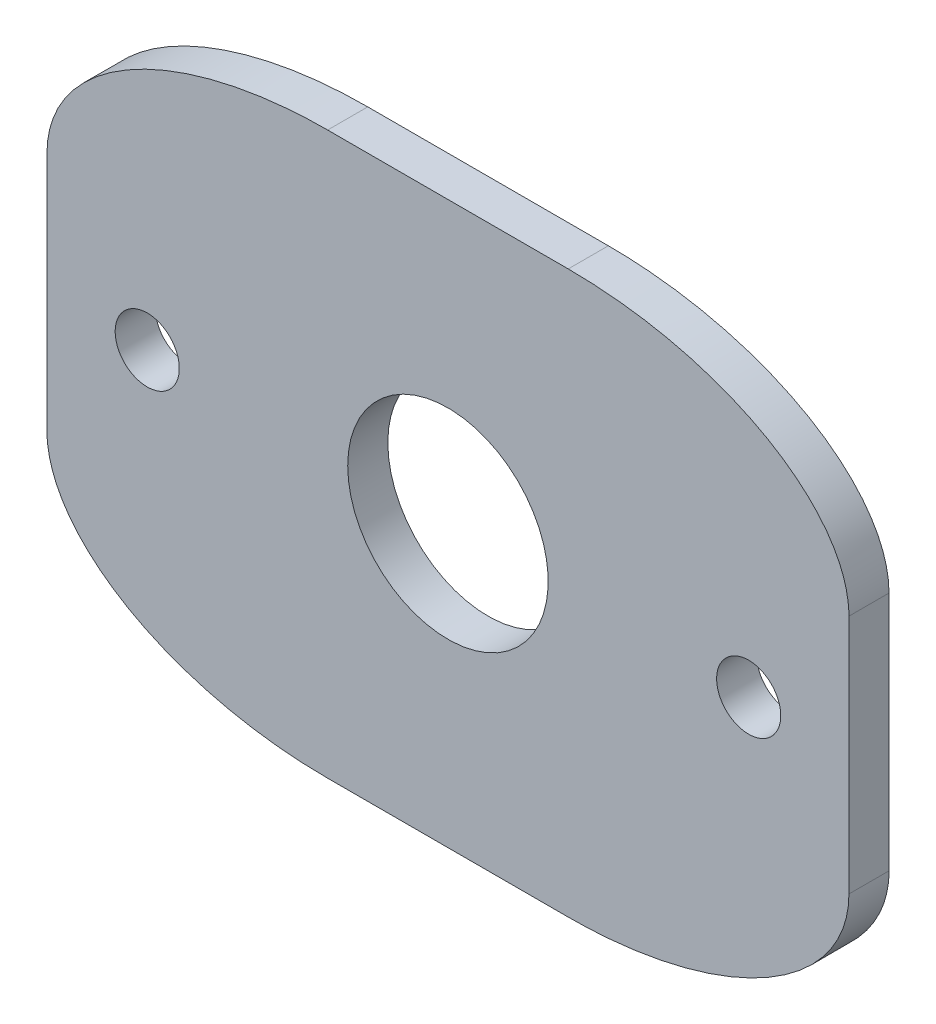
ISO-10303-21;
HEADER;
FILE_DESCRIPTION(('STEP AP214'),'2;1');
FILE_NAME('part.step','',(''),(''),'','','');
FILE_SCHEMA(('AUTOMOTIVE_DESIGN { 1 0 10303 214 1 1 1 1 }'));
ENDSEC;
DATA;
#1=APPLICATION_CONTEXT('core data for automotive mechanical design processes');
#2=APPLICATION_PROTOCOL_DEFINITION('international standard','automotive_design',2000,#1);
#3=PRODUCT_CONTEXT('',#1,'mechanical');
#4=PRODUCT('Part','Part','',(#3));
#5=PRODUCT_RELATED_PRODUCT_CATEGORY('part','',(#4));
#6=PRODUCT_DEFINITION_FORMATION('','',#4);
#7=PRODUCT_DEFINITION_CONTEXT('part definition',#1,'design');
#8=PRODUCT_DEFINITION('design','',#6,#7);
#9=PRODUCT_DEFINITION_SHAPE('','',#8);
#10=(LENGTH_UNIT() NAMED_UNIT(*) SI_UNIT(.MILLI.,.METRE.));
#11=(NAMED_UNIT(*) PLANE_ANGLE_UNIT() SI_UNIT($,.RADIAN.));
#12=(NAMED_UNIT(*) SI_UNIT($,.STERADIAN.) SOLID_ANGLE_UNIT());
#13=UNCERTAINTY_MEASURE_WITH_UNIT(LENGTH_MEASURE(1.E-05),#10,'distance_accuracy_value','');
#14=(GEOMETRIC_REPRESENTATION_CONTEXT(3) GLOBAL_UNCERTAINTY_ASSIGNED_CONTEXT((#13)) GLOBAL_UNIT_ASSIGNED_CONTEXT((#10,
#11,#12)) REPRESENTATION_CONTEXT('',''));
#15=CARTESIAN_POINT('',(0.,0.,0.));
#16=DIRECTION('',(0.,0.,1.));
#17=DIRECTION('',(1.,0.,0.));
#18=AXIS2_PLACEMENT_3D('',#15,#16,#17);
#19=CARTESIAN_POINT('',(20.,-14.,2.));
#20=DIRECTION('',(-1.,0.,0.));
#21=DIRECTION('',(0.,0.,1.));
#22=AXIS2_PLACEMENT_3D('',#19,#20,#21);
#23=PLANE('',#22);
#24=DIRECTION('',(0.,1.,0.));
#25=VECTOR('',#24,1.);
#26=CARTESIAN_POINT('',(20.,-14.,2.));
#27=LINE('',#26,#25);
#28=CARTESIAN_POINT('',(20.,-6.,2.));
#29=VERTEX_POINT('',#28);
#30=CARTESIAN_POINT('',(20.,6.,2.));
#31=VERTEX_POINT('',#30);
#32=EDGE_CURVE('E165',#29,#31,#27,.T.);
#33=ORIENTED_EDGE('',*,*,#32,.F.);
#34=CARTESIAN_POINT('',(20.,-6.,-0.1));
#35=CARTESIAN_POINT('',(20.,-6.,0.633333333333333));
#36=CARTESIAN_POINT('',(20.,-6.,1.36666666666667));
#37=CARTESIAN_POINT('',(20.,-6.,2.1));
#38=(BOUNDED_CURVE() B_SPLINE_CURVE(3,(#34,#35,#36,#37),.UNSPECIFIED.,.F.,
.F.) B_SPLINE_CURVE_WITH_KNOTS((4,4),(-9.99999999999998E-05,0.0021),
.UNSPECIFIED.) CURVE() GEOMETRIC_REPRESENTATION_ITEM() RATIONAL_B_SPLINE_CURVE((1.,1.,1.,1.)) REPRESENTATION_ITEM(''));
#39=CARTESIAN_POINT('',(20.,-6.,0.));
#40=VERTEX_POINT('',#39);
#41=EDGE_CURVE('E12',#29,#40,#38,.F.);
#42=ORIENTED_EDGE('',*,*,#41,.T.);
#43=DIRECTION('',(0.,1.,0.));
#44=VECTOR('',#43,1.);
#45=CARTESIAN_POINT('',(20.,-14.,0.));
#46=LINE('',#45,#44);
#47=CARTESIAN_POINT('',(20.,6.,0.));
#48=VERTEX_POINT('',#47);
#49=EDGE_CURVE('E167',#40,#48,#46,.T.);
#50=ORIENTED_EDGE('',*,*,#49,.T.);
#51=CARTESIAN_POINT('',(20.,6.,2.1));
#52=CARTESIAN_POINT('',(20.,6.,1.36666666666667));
#53=CARTESIAN_POINT('',(20.,6.,0.633333333333333));
#54=CARTESIAN_POINT('',(20.,6.,-0.1));
#55=(BOUNDED_CURVE() B_SPLINE_CURVE(3,(#51,#52,#53,#54),.UNSPECIFIED.,.F.,
.F.) B_SPLINE_CURVE_WITH_KNOTS((4,4),(-0.0001,0.0021),
.UNSPECIFIED.) CURVE() GEOMETRIC_REPRESENTATION_ITEM() RATIONAL_B_SPLINE_CURVE((1.,1.,1.,1.)) REPRESENTATION_ITEM(''));
#56=EDGE_CURVE('E63',#48,#31,#55,.F.);
#57=ORIENTED_EDGE('',*,*,#56,.T.);
#58=EDGE_LOOP('',(#33,#42,#50,#57));
#59=FACE_BOUND('',#58,.T.);
#60=ADVANCED_FACE('F49',(#59),#23,.F.);
#61=CARTESIAN_POINT('',(-20.,14.,2.));
#62=DIRECTION('',(0.,-1.,0.));
#63=DIRECTION('',(0.,0.,-1.));
#64=AXIS2_PLACEMENT_3D('',#61,#62,#63);
#65=PLANE('',#64);
#66=DIRECTION('',(-1.,0.,0.));
#67=VECTOR('',#66,1.);
#68=CARTESIAN_POINT('',(-20.,14.,0.));
#69=LINE('',#68,#67);
#70=CARTESIAN_POINT('',(6.00000000000001,14.,0.));
#71=VERTEX_POINT('',#70);
#72=CARTESIAN_POINT('',(-6.,14.,0.));
#73=VERTEX_POINT('',#72);
#74=EDGE_CURVE('E161',#71,#73,#69,.T.);
#75=ORIENTED_EDGE('',*,*,#74,.T.);
#76=CARTESIAN_POINT('',(-6.,14.,2.1));
#77=CARTESIAN_POINT('',(-6.,14.,1.36666666666667));
#78=CARTESIAN_POINT('',(-6.,14.,0.633333333333333));
#79=CARTESIAN_POINT('',(-6.,14.,-0.1));
#80=(BOUNDED_CURVE() B_SPLINE_CURVE(3,(#76,#77,#78,#79),.UNSPECIFIED.,.F.,
.F.) B_SPLINE_CURVE_WITH_KNOTS((4,4),(-0.0001,0.0021),
.UNSPECIFIED.) CURVE() GEOMETRIC_REPRESENTATION_ITEM() RATIONAL_B_SPLINE_CURVE((1.,1.,1.,1.)) REPRESENTATION_ITEM(''));
#81=CARTESIAN_POINT('',(-6.,14.,2.));
#82=VERTEX_POINT('',#81);
#83=EDGE_CURVE('E131',#73,#82,#80,.F.);
#84=ORIENTED_EDGE('',*,*,#83,.T.);
#85=DIRECTION('',(-1.,0.,0.));
#86=VECTOR('',#85,1.);
#87=CARTESIAN_POINT('',(-20.,14.,2.));
#88=LINE('',#87,#86);
#89=CARTESIAN_POINT('',(6.00000000000001,14.,2.));
#90=VERTEX_POINT('',#89);
#91=EDGE_CURVE('E224',#90,#82,#88,.T.);
#92=ORIENTED_EDGE('',*,*,#91,.F.);
#93=CARTESIAN_POINT('',(6.00000000000001,14.,-0.1));
#94=CARTESIAN_POINT('',(6.00000000000001,14.,0.633333333333333));
#95=CARTESIAN_POINT('',(6.00000000000001,14.,1.36666666666667));
#96=CARTESIAN_POINT('',(6.00000000000001,14.,2.1));
#97=(BOUNDED_CURVE() B_SPLINE_CURVE(3,(#93,#94,#95,#96),.UNSPECIFIED.,.F.,
.F.) B_SPLINE_CURVE_WITH_KNOTS((4,4),(-9.99999999999998E-05,0.0021),
.UNSPECIFIED.) CURVE() GEOMETRIC_REPRESENTATION_ITEM() RATIONAL_B_SPLINE_CURVE((1.,1.,1.,1.)) REPRESENTATION_ITEM(''));
#98=EDGE_CURVE('E139',#90,#71,#97,.F.);
#99=ORIENTED_EDGE('',*,*,#98,.T.);
#100=EDGE_LOOP('',(#75,#84,#92,#99));
#101=FACE_BOUND('',#100,.T.);
#102=ADVANCED_FACE('F327',(#101),#65,.F.);
#103=CARTESIAN_POINT('',(-20.,-14.,2.));
#104=DIRECTION('',(1.,0.,0.));
#105=DIRECTION('',(0.,0.,-1.));
#106=AXIS2_PLACEMENT_3D('',#103,#104,#105);
#107=PLANE('',#106);
#108=DIRECTION('',(0.,-1.,0.));
#109=VECTOR('',#108,1.);
#110=CARTESIAN_POINT('',(-20.,-14.,2.));
#111=LINE('',#110,#109);
#112=CARTESIAN_POINT('',(-20.,6.,2.));
#113=VERTEX_POINT('',#112);
#114=CARTESIAN_POINT('',(-20.,-6.,2.));
#115=VERTEX_POINT('',#114);
#116=EDGE_CURVE('E150',#113,#115,#111,.T.);
#117=ORIENTED_EDGE('',*,*,#116,.F.);
#118=CARTESIAN_POINT('',(-20.,6.,-0.1));
#119=CARTESIAN_POINT('',(-20.,6.,0.633333333333333));
#120=CARTESIAN_POINT('',(-20.,6.,1.36666666666667));
#121=CARTESIAN_POINT('',(-20.,6.,2.1));
#122=(BOUNDED_CURVE() B_SPLINE_CURVE(3,(#118,#119,#120,#121),.UNSPECIFIED.,.F.,
.F.) B_SPLINE_CURVE_WITH_KNOTS((4,4),(-9.99999999999998E-05,0.0021),
.UNSPECIFIED.) CURVE() GEOMETRIC_REPRESENTATION_ITEM() RATIONAL_B_SPLINE_CURVE((1.,1.,1.,1.)) REPRESENTATION_ITEM(''));
#123=CARTESIAN_POINT('',(-20.,6.,0.));
#124=VERTEX_POINT('',#123);
#125=EDGE_CURVE('E129',#113,#124,#122,.F.);
#126=ORIENTED_EDGE('',*,*,#125,.T.);
#127=DIRECTION('',(0.,-1.,0.));
#128=VECTOR('',#127,1.);
#129=CARTESIAN_POINT('',(-20.,-14.,0.));
#130=LINE('',#129,#128);
#131=CARTESIAN_POINT('',(-20.,-6.,0.));
#132=VERTEX_POINT('',#131);
#133=EDGE_CURVE('E148',#124,#132,#130,.T.);
#134=ORIENTED_EDGE('',*,*,#133,.T.);
#135=CARTESIAN_POINT('',(-20.,-6.,2.1));
#136=CARTESIAN_POINT('',(-20.,-6.,1.36666666666667));
#137=CARTESIAN_POINT('',(-20.,-6.,0.633333333333333));
#138=CARTESIAN_POINT('',(-20.,-6.,-0.1));
#139=(BOUNDED_CURVE() B_SPLINE_CURVE(3,(#135,#136,#137,#138),.UNSPECIFIED.,.F.,
.F.) B_SPLINE_CURVE_WITH_KNOTS((4,4),(-0.0001,0.0021),
.UNSPECIFIED.) CURVE() GEOMETRIC_REPRESENTATION_ITEM() RATIONAL_B_SPLINE_CURVE((1.,1.,1.,1.)) REPRESENTATION_ITEM(''));
#140=EDGE_CURVE('E153',#132,#115,#139,.F.);
#141=ORIENTED_EDGE('',*,*,#140,.T.);
#142=EDGE_LOOP('',(#117,#126,#134,#141));
#143=FACE_BOUND('',#142,.T.);
#144=ADVANCED_FACE('F147',(#143),#107,.F.);
#145=CARTESIAN_POINT('',(-20.,-14.,2.));
#146=DIRECTION('',(0.,1.,0.));
#147=DIRECTION('',(0.,0.,1.));
#148=AXIS2_PLACEMENT_3D('',#145,#146,#147);
#149=PLANE('',#148);
#150=DIRECTION('',(1.,0.,0.));
#151=VECTOR('',#150,1.);
#152=CARTESIAN_POINT('',(-20.,-14.,2.));
#153=LINE('',#152,#151);
#154=CARTESIAN_POINT('',(-6.,-14.,2.));
#155=VERTEX_POINT('',#154);
#156=CARTESIAN_POINT('',(6.00000000000001,-14.,2.));
#157=VERTEX_POINT('',#156);
#158=EDGE_CURVE('E243',#155,#157,#153,.T.);
#159=ORIENTED_EDGE('',*,*,#158,.F.);
#160=CARTESIAN_POINT('',(-6.,-14.,-0.1));
#161=CARTESIAN_POINT('',(-6.,-14.,0.633333333333333));
#162=CARTESIAN_POINT('',(-6.,-14.,1.36666666666667));
#163=CARTESIAN_POINT('',(-6.,-14.,2.1));
#164=(BOUNDED_CURVE() B_SPLINE_CURVE(3,(#160,#161,#162,#163),.UNSPECIFIED.,.F.,
.F.) B_SPLINE_CURVE_WITH_KNOTS((4,4),(-9.99999999999998E-05,0.0021),
.UNSPECIFIED.) CURVE() GEOMETRIC_REPRESENTATION_ITEM() RATIONAL_B_SPLINE_CURVE((1.,1.,1.,1.)) REPRESENTATION_ITEM(''));
#165=CARTESIAN_POINT('',(-6.,-14.,0.));
#166=VERTEX_POINT('',#165);
#167=EDGE_CURVE('E302',#155,#166,#164,.F.);
#168=ORIENTED_EDGE('',*,*,#167,.T.);
#169=DIRECTION('',(1.,0.,0.));
#170=VECTOR('',#169,1.);
#171=CARTESIAN_POINT('',(-20.,-14.,0.));
#172=LINE('',#171,#170);
#173=CARTESIAN_POINT('',(6.,-14.,0.));
#174=VERTEX_POINT('',#173);
#175=EDGE_CURVE('E160',#166,#174,#172,.T.);
#176=ORIENTED_EDGE('',*,*,#175,.T.);
#177=CARTESIAN_POINT('',(6.,-14.,2.1));
#178=CARTESIAN_POINT('',(6.,-14.,1.36666666666667));
#179=CARTESIAN_POINT('',(6.,-14.,0.633333333333333));
#180=CARTESIAN_POINT('',(6.,-14.,-0.1));
#181=(BOUNDED_CURVE() B_SPLINE_CURVE(3,(#177,#178,#179,#180),.UNSPECIFIED.,.F.,
.F.) B_SPLINE_CURVE_WITH_KNOTS((4,4),(-0.0001,0.0021),
.UNSPECIFIED.) CURVE() GEOMETRIC_REPRESENTATION_ITEM() RATIONAL_B_SPLINE_CURVE((1.,1.,1.,1.)) REPRESENTATION_ITEM(''));
#182=EDGE_CURVE('E70',#174,#157,#181,.F.);
#183=ORIENTED_EDGE('',*,*,#182,.T.);
#184=EDGE_LOOP('',(#159,#168,#176,#183));
#185=FACE_BOUND('',#184,.T.);
#186=ADVANCED_FACE('F204',(#185),#149,.F.);
#187=CARTESIAN_POINT('',(0.,0.,2.));
#188=DIRECTION('',(0.,0.,-1.));
#189=DIRECTION('',(-1.,0.,0.));
#190=AXIS2_PLACEMENT_3D('',#187,#188,#189);
#191=PLANE('',#190);
#192=CARTESIAN_POINT('',(-15.,-5.41871926468828E-10,2.));
#193=DIRECTION('',(0.,0.,-1.));
#194=DIRECTION('',(-1.,0.,0.));
#195=AXIS2_PLACEMENT_3D('',#192,#193,#194);
#196=CIRCLE('',#195,1.6);
#197=CARTESIAN_POINT('',(-16.6,-5.41871926468828E-10,2.));
#198=VERTEX_POINT('',#197);
#199=EDGE_CURVE('E524',#198,#198,#196,.T.);
#200=ORIENTED_EDGE('',*,*,#199,.T.);
#201=EDGE_LOOP('',(#200));
#202=FACE_BOUND('',#201,.T.);
#203=CARTESIAN_POINT('',(15.,-5.41871926468828E-10,2.));
#204=DIRECTION('',(0.,0.,-1.));
#205=DIRECTION('',(-1.,0.,0.));
#206=AXIS2_PLACEMENT_3D('',#203,#204,#205);
#207=CIRCLE('',#206,1.6);
#208=CARTESIAN_POINT('',(13.4,-5.41871926468828E-10,2.));
#209=VERTEX_POINT('',#208);
#210=EDGE_CURVE('E513',#209,#209,#207,.T.);
#211=ORIENTED_EDGE('',*,*,#210,.T.);
#212=EDGE_LOOP('',(#211));
#213=FACE_BOUND('',#212,.T.);
#214=CARTESIAN_POINT('',(0.,0.,2.));
#215=DIRECTION('',(0.,0.,-1.));
#216=DIRECTION('',(-1.,0.,0.));
#217=AXIS2_PLACEMENT_3D('',#214,#215,#216);
#218=CIRCLE('',#217,5.);
#219=CARTESIAN_POINT('',(-5.,0.,2.));
#220=VERTEX_POINT('',#219);
#221=EDGE_CURVE('E509',#220,#220,#218,.T.);
#222=ORIENTED_EDGE('',*,*,#221,.T.);
#223=EDGE_LOOP('',(#222));
#224=FACE_BOUND('',#223,.T.);
#225=ORIENTED_EDGE('',*,*,#91,.T.);
#226=CARTESIAN_POINT('',(-20.,6.,2.));
#227=CARTESIAN_POINT('',(-20.,14.,2.));
#228=CARTESIAN_POINT('',(-6.,14.,2.));
#229=(BOUNDED_CURVE() B_SPLINE_CURVE(2,(#226,#227,#228),.UNSPECIFIED.,.F.,
.F.) B_SPLINE_CURVE_WITH_KNOTS((3,3),(0.,1.),
.UNSPECIFIED.) CURVE() GEOMETRIC_REPRESENTATION_ITEM() RATIONAL_B_SPLINE_CURVE((1.,
0.707106781186548,1.)) REPRESENTATION_ITEM(''));
#230=EDGE_CURVE('E282',#82,#113,#229,.F.);
#231=ORIENTED_EDGE('',*,*,#230,.T.);
#232=ORIENTED_EDGE('',*,*,#116,.T.);
#233=CARTESIAN_POINT('',(-6.,-14.,2.));
#234=CARTESIAN_POINT('',(-20.,-14.,2.));
#235=CARTESIAN_POINT('',(-20.,-6.,2.));
#236=(BOUNDED_CURVE() B_SPLINE_CURVE(2,(#233,#234,#235),.UNSPECIFIED.,.F.,
.F.) B_SPLINE_CURVE_WITH_KNOTS((3,3),(0.,1.),
.UNSPECIFIED.) CURVE() GEOMETRIC_REPRESENTATION_ITEM() RATIONAL_B_SPLINE_CURVE((1.,
0.707106781186548,1.)) REPRESENTATION_ITEM(''));
#237=EDGE_CURVE('E78',#115,#155,#236,.F.);
#238=ORIENTED_EDGE('',*,*,#237,.T.);
#239=ORIENTED_EDGE('',*,*,#158,.T.);
#240=CARTESIAN_POINT('',(20.,-6.,2.));
#241=CARTESIAN_POINT('',(20.,-14.,2.));
#242=CARTESIAN_POINT('',(6.,-14.,2.));
#243=(BOUNDED_CURVE() B_SPLINE_CURVE(2,(#240,#241,#242),.UNSPECIFIED.,.F.,
.F.) B_SPLINE_CURVE_WITH_KNOTS((3,3),(0.,1.),
.UNSPECIFIED.) CURVE() GEOMETRIC_REPRESENTATION_ITEM() RATIONAL_B_SPLINE_CURVE((1.,
0.707106781186548,1.)) REPRESENTATION_ITEM(''));
#244=EDGE_CURVE('E263',#157,#29,#243,.F.);
#245=ORIENTED_EDGE('',*,*,#244,.T.);
#246=ORIENTED_EDGE('',*,*,#32,.T.);
#247=CARTESIAN_POINT('',(6.00000000000001,14.,2.));
#248=CARTESIAN_POINT('',(20.,14.,2.));
#249=CARTESIAN_POINT('',(20.,6.,2.));
#250=(BOUNDED_CURVE() B_SPLINE_CURVE(2,(#247,#248,#249),.UNSPECIFIED.,.F.,
.F.) B_SPLINE_CURVE_WITH_KNOTS((3,3),(0.,1.),
.UNSPECIFIED.) CURVE() GEOMETRIC_REPRESENTATION_ITEM() RATIONAL_B_SPLINE_CURVE((1.,
0.707106781186547,1.)) REPRESENTATION_ITEM(''));
#251=EDGE_CURVE('E251',#31,#90,#250,.F.);
#252=ORIENTED_EDGE('',*,*,#251,.T.);
#253=EDGE_LOOP('',(#225,#231,#232,#238,#239,#245,#246,#252));
#254=FACE_BOUND('',#253,.T.);
#255=ADVANCED_FACE('F200',(#202,#213,#224,#254),#191,.F.);
#256=CARTESIAN_POINT('',(0.,0.,0.));
#257=DIRECTION('',(0.,0.,-1.));
#258=DIRECTION('',(-1.,0.,0.));
#259=AXIS2_PLACEMENT_3D('',#256,#257,#258);
#260=PLANE('',#259);
#261=CARTESIAN_POINT('',(-15.,-5.41871926468828E-10,0.));
#262=DIRECTION('',(0.,0.,-1.));
#263=DIRECTION('',(-1.,0.,0.));
#264=AXIS2_PLACEMENT_3D('',#261,#262,#263);
#265=CIRCLE('',#264,1.6);
#266=CARTESIAN_POINT('',(-16.6,-5.41871926468828E-10,0.));
#267=VERTEX_POINT('',#266);
#268=EDGE_CURVE('E57',#267,#267,#265,.T.);
#269=ORIENTED_EDGE('',*,*,#268,.F.);
#270=EDGE_LOOP('',(#269));
#271=FACE_BOUND('',#270,.T.);
#272=CARTESIAN_POINT('',(15.,-5.41871926468828E-10,0.));
#273=DIRECTION('',(0.,0.,-1.));
#274=DIRECTION('',(-1.,0.,0.));
#275=AXIS2_PLACEMENT_3D('',#272,#273,#274);
#276=CIRCLE('',#275,1.6);
#277=CARTESIAN_POINT('',(13.4,-5.41871926468828E-10,0.));
#278=VERTEX_POINT('',#277);
#279=EDGE_CURVE('E510',#278,#278,#276,.T.);
#280=ORIENTED_EDGE('',*,*,#279,.F.);
#281=EDGE_LOOP('',(#280));
#282=FACE_BOUND('',#281,.T.);
#283=CARTESIAN_POINT('',(0.,0.,0.));
#284=DIRECTION('',(0.,0.,-1.));
#285=DIRECTION('',(-1.,0.,0.));
#286=AXIS2_PLACEMENT_3D('',#283,#284,#285);
#287=CIRCLE('',#286,5.);
#288=CARTESIAN_POINT('',(-5.,0.,0.));
#289=VERTEX_POINT('',#288);
#290=EDGE_CURVE('E501',#289,#289,#287,.T.);
#291=ORIENTED_EDGE('',*,*,#290,.F.);
#292=EDGE_LOOP('',(#291));
#293=FACE_BOUND('',#292,.T.);
#294=ORIENTED_EDGE('',*,*,#133,.F.);
#295=CARTESIAN_POINT('',(-6.,14.,0.));
#296=CARTESIAN_POINT('',(-20.,14.,0.));
#297=CARTESIAN_POINT('',(-20.,6.,0.));
#298=(BOUNDED_CURVE() B_SPLINE_CURVE(2,(#295,#296,#297),.UNSPECIFIED.,.F.,
.F.) B_SPLINE_CURVE_WITH_KNOTS((3,3),(0.,1.),
.UNSPECIFIED.) CURVE() GEOMETRIC_REPRESENTATION_ITEM() RATIONAL_B_SPLINE_CURVE((1.,
0.707106781186548,1.)) REPRESENTATION_ITEM(''));
#299=EDGE_CURVE('E124',#124,#73,#298,.F.);
#300=ORIENTED_EDGE('',*,*,#299,.T.);
#301=ORIENTED_EDGE('',*,*,#74,.F.);
#302=CARTESIAN_POINT('',(20.,6.,0.));
#303=CARTESIAN_POINT('',(20.,14.,0.));
#304=CARTESIAN_POINT('',(6.00000000000001,14.,0.));
#305=(BOUNDED_CURVE() B_SPLINE_CURVE(2,(#302,#303,#304),.UNSPECIFIED.,.F.,
.F.) B_SPLINE_CURVE_WITH_KNOTS((3,3),(0.,1.),
.UNSPECIFIED.) CURVE() GEOMETRIC_REPRESENTATION_ITEM() RATIONAL_B_SPLINE_CURVE((1.,
0.707106781186547,1.)) REPRESENTATION_ITEM(''));
#306=EDGE_CURVE('E152',#71,#48,#305,.F.);
#307=ORIENTED_EDGE('',*,*,#306,.T.);
#308=ORIENTED_EDGE('',*,*,#49,.F.);
#309=CARTESIAN_POINT('',(6.,-14.,0.));
#310=CARTESIAN_POINT('',(20.,-14.,0.));
#311=CARTESIAN_POINT('',(20.,-6.,0.));
#312=(BOUNDED_CURVE() B_SPLINE_CURVE(2,(#309,#310,#311),.UNSPECIFIED.,.F.,
.F.) B_SPLINE_CURVE_WITH_KNOTS((3,3),(0.,1.),
.UNSPECIFIED.) CURVE() GEOMETRIC_REPRESENTATION_ITEM() RATIONAL_B_SPLINE_CURVE((1.,
0.707106781186548,1.)) REPRESENTATION_ITEM(''));
#313=EDGE_CURVE('E421',#40,#174,#312,.F.);
#314=ORIENTED_EDGE('',*,*,#313,.T.);
#315=ORIENTED_EDGE('',*,*,#175,.F.);
#316=CARTESIAN_POINT('',(-20.,-6.,0.));
#317=CARTESIAN_POINT('',(-20.,-14.,0.));
#318=CARTESIAN_POINT('',(-6.,-14.,0.));
#319=(BOUNDED_CURVE() B_SPLINE_CURVE(2,(#316,#317,#318),.UNSPECIFIED.,.F.,
.F.) B_SPLINE_CURVE_WITH_KNOTS((3,3),(0.,1.),
.UNSPECIFIED.) CURVE() GEOMETRIC_REPRESENTATION_ITEM() RATIONAL_B_SPLINE_CURVE((1.,
0.707106781186548,1.)) REPRESENTATION_ITEM(''));
#320=EDGE_CURVE('E140',#166,#132,#319,.F.);
#321=ORIENTED_EDGE('',*,*,#320,.T.);
#322=EDGE_LOOP('',(#294,#300,#301,#307,#308,#314,#315,#321));
#323=FACE_BOUND('',#322,.T.);
#324=ADVANCED_FACE('F156',(#271,#282,#293,#323),#260,.T.);
#325=CARTESIAN_POINT('',(-20.,6.,2.1));
#326=CARTESIAN_POINT('',(-20.,6.,1.36666666666667));
#327=CARTESIAN_POINT('',(-20.,6.,0.633333333333333));
#328=CARTESIAN_POINT('',(-20.,6.,-0.1));
#329=CARTESIAN_POINT('',(-20.,14.,2.1));
#330=CARTESIAN_POINT('',(-20.,14.,1.36666666666667));
#331=CARTESIAN_POINT('',(-20.,14.,0.633333333333333));
#332=CARTESIAN_POINT('',(-20.,14.,-0.1));
#333=CARTESIAN_POINT('',(-6.,14.,2.1));
#334=CARTESIAN_POINT('',(-6.,14.,1.36666666666667));
#335=CARTESIAN_POINT('',(-6.,14.,0.633333333333333));
#336=CARTESIAN_POINT('',(-6.,14.,-0.1));
#337=(BOUNDED_SURFACE() B_SPLINE_SURFACE(2,3,((#325,#326,#327,#328),(#329,#330,#331,#332),(#333,
#334,#335,#336)),.UNSPECIFIED.,.F.,.F.,.F.) B_SPLINE_SURFACE_WITH_KNOTS((3,3),(4,4),(0.,1.),
(-0.0001,0.0021),.UNSPECIFIED.) GEOMETRIC_REPRESENTATION_ITEM() RATIONAL_B_SPLINE_SURFACE(((1.,
1.,1.,1.),(0.707106781186548,0.707106781186548,0.707106781186548,0.707106781186548),(1.,1.,1.,1.))) REPRESENTATION_ITEM('') SURFACE());
#338=ORIENTED_EDGE('',*,*,#230,.F.);
#339=ORIENTED_EDGE('',*,*,#83,.F.);
#340=ORIENTED_EDGE('',*,*,#299,.F.);
#341=ORIENTED_EDGE('',*,*,#125,.F.);
#342=EDGE_LOOP('',(#338,#339,#340,#341));
#343=FACE_BOUND('',#342,.T.);
#344=ADVANCED_FACE('F128',(#343),#337,.T.);
#345=CARTESIAN_POINT('',(-6.,-14.,2.1));
#346=CARTESIAN_POINT('',(-6.,-14.,1.36666666666667));
#347=CARTESIAN_POINT('',(-6.,-14.,0.633333333333333));
#348=CARTESIAN_POINT('',(-6.,-14.,-0.1));
#349=CARTESIAN_POINT('',(-20.,-14.,2.1));
#350=CARTESIAN_POINT('',(-20.,-14.,1.36666666666667));
#351=CARTESIAN_POINT('',(-20.,-14.,0.633333333333333));
#352=CARTESIAN_POINT('',(-20.,-14.,-0.1));
#353=CARTESIAN_POINT('',(-20.,-6.,2.1));
#354=CARTESIAN_POINT('',(-20.,-6.,1.36666666666667));
#355=CARTESIAN_POINT('',(-20.,-6.,0.633333333333333));
#356=CARTESIAN_POINT('',(-20.,-6.,-0.1));
#357=(BOUNDED_SURFACE() B_SPLINE_SURFACE(2,3,((#345,#346,#347,#348),(#349,#350,#351,#352),(#353,
#354,#355,#356)),.UNSPECIFIED.,.F.,.F.,.F.) B_SPLINE_SURFACE_WITH_KNOTS((3,3),(4,4),(0.,1.),
(-0.0001,0.0021),.UNSPECIFIED.) GEOMETRIC_REPRESENTATION_ITEM() RATIONAL_B_SPLINE_SURFACE(((1.,
1.,1.,1.),(0.707106781186548,0.707106781186548,0.707106781186548,0.707106781186548),(1.,1.,1.,1.))) REPRESENTATION_ITEM('') SURFACE());
#358=ORIENTED_EDGE('',*,*,#237,.F.);
#359=ORIENTED_EDGE('',*,*,#140,.F.);
#360=ORIENTED_EDGE('',*,*,#320,.F.);
#361=ORIENTED_EDGE('',*,*,#167,.F.);
#362=EDGE_LOOP('',(#358,#359,#360,#361));
#363=FACE_BOUND('',#362,.T.);
#364=ADVANCED_FACE('F346',(#363),#357,.T.);
#365=CARTESIAN_POINT('',(20.,-6.,2.1));
#366=CARTESIAN_POINT('',(20.,-6.,1.36666666666667));
#367=CARTESIAN_POINT('',(20.,-6.,0.633333333333333));
#368=CARTESIAN_POINT('',(20.,-6.,-0.1));
#369=CARTESIAN_POINT('',(20.,-14.,2.1));
#370=CARTESIAN_POINT('',(20.,-14.,1.36666666666667));
#371=CARTESIAN_POINT('',(20.,-14.,0.633333333333333));
#372=CARTESIAN_POINT('',(20.,-14.,-0.1));
#373=CARTESIAN_POINT('',(6.,-14.,2.1));
#374=CARTESIAN_POINT('',(6.,-14.,1.36666666666667));
#375=CARTESIAN_POINT('',(6.,-14.,0.633333333333333));
#376=CARTESIAN_POINT('',(6.,-14.,-0.1));
#377=(BOUNDED_SURFACE() B_SPLINE_SURFACE(2,3,((#365,#366,#367,#368),(#369,#370,#371,#372),(#373,
#374,#375,#376)),.UNSPECIFIED.,.F.,.F.,.F.) B_SPLINE_SURFACE_WITH_KNOTS((3,3),(4,4),(0.,1.),
(-0.0001,0.0021),.UNSPECIFIED.) GEOMETRIC_REPRESENTATION_ITEM() RATIONAL_B_SPLINE_SURFACE(((1.,
1.,1.,1.),(0.707106781186548,0.707106781186548,0.707106781186548,0.707106781186548),(1.,1.,1.,1.))) REPRESENTATION_ITEM('') SURFACE());
#378=ORIENTED_EDGE('',*,*,#244,.F.);
#379=ORIENTED_EDGE('',*,*,#182,.F.);
#380=ORIENTED_EDGE('',*,*,#313,.F.);
#381=ORIENTED_EDGE('',*,*,#41,.F.);
#382=EDGE_LOOP('',(#378,#379,#380,#381));
#383=FACE_BOUND('',#382,.T.);
#384=ADVANCED_FACE('F427',(#383),#377,.T.);
#385=CARTESIAN_POINT('',(6.00000000000001,14.,2.1));
#386=CARTESIAN_POINT('',(6.00000000000001,14.,1.36666666666667));
#387=CARTESIAN_POINT('',(6.00000000000001,14.,0.633333333333333));
#388=CARTESIAN_POINT('',(6.00000000000001,14.,-0.1));
#389=CARTESIAN_POINT('',(20.,14.,2.1));
#390=CARTESIAN_POINT('',(20.,14.,1.36666666666667));
#391=CARTESIAN_POINT('',(20.,14.,0.633333333333333));
#392=CARTESIAN_POINT('',(20.,14.,-0.1));
#393=CARTESIAN_POINT('',(20.,6.,2.1));
#394=CARTESIAN_POINT('',(20.,6.,1.36666666666667));
#395=CARTESIAN_POINT('',(20.,6.,0.633333333333333));
#396=CARTESIAN_POINT('',(20.,6.,-0.1));
#397=(BOUNDED_SURFACE() B_SPLINE_SURFACE(2,3,((#385,#386,#387,#388),(#389,#390,#391,#392),(#393,
#394,#395,#396)),.UNSPECIFIED.,.F.,.F.,.F.) B_SPLINE_SURFACE_WITH_KNOTS((3,3),(4,4),(0.,1.),
(-0.0001,0.0021),.UNSPECIFIED.) GEOMETRIC_REPRESENTATION_ITEM() RATIONAL_B_SPLINE_SURFACE(((1.,
1.,1.,1.),(0.707106781186547,0.707106781186547,0.707106781186547,0.707106781186547),(1.,1.,1.,1.))) REPRESENTATION_ITEM('') SURFACE());
#398=ORIENTED_EDGE('',*,*,#251,.F.);
#399=ORIENTED_EDGE('',*,*,#56,.F.);
#400=ORIENTED_EDGE('',*,*,#306,.F.);
#401=ORIENTED_EDGE('',*,*,#98,.F.);
#402=EDGE_LOOP('',(#398,#399,#400,#401));
#403=FACE_BOUND('',#402,.T.);
#404=ADVANCED_FACE('F52',(#403),#397,.T.);
#405=CARTESIAN_POINT('',(0.,0.,-0.0549999999999995));
#406=DIRECTION('',(0.,0.,1.));
#407=DIRECTION('',(1.,0.,0.));
#408=AXIS2_PLACEMENT_3D('',#405,#406,#407);
#409=CYLINDRICAL_SURFACE('',#408,5.);
#410=ORIENTED_EDGE('',*,*,#290,.T.);
#411=EDGE_LOOP('',(#410));
#412=FACE_BOUND('',#411,.T.);
#413=ORIENTED_EDGE('',*,*,#221,.F.);
#414=EDGE_LOOP('',(#413));
#415=FACE_BOUND('',#414,.T.);
#416=ADVANCED_FACE('F540',(#412,#415),#409,.F.);
#417=CARTESIAN_POINT('',(15.,-5.41871926468828E-10,-0.0549999999999995));
#418=DIRECTION('',(0.,0.,1.));
#419=DIRECTION('',(1.,0.,0.));
#420=AXIS2_PLACEMENT_3D('',#417,#418,#419);
#421=CYLINDRICAL_SURFACE('',#420,1.6);
#422=ORIENTED_EDGE('',*,*,#279,.T.);
#423=EDGE_LOOP('',(#422));
#424=FACE_BOUND('',#423,.T.);
#425=ORIENTED_EDGE('',*,*,#210,.F.);
#426=EDGE_LOOP('',(#425));
#427=FACE_BOUND('',#426,.T.);
#428=ADVANCED_FACE('F543',(#424,#427),#421,.F.);
#429=CARTESIAN_POINT('',(-15.,-5.41871926468828E-10,-0.0549999999999995));
#430=DIRECTION('',(0.,0.,1.));
#431=DIRECTION('',(1.,0.,0.));
#432=AXIS2_PLACEMENT_3D('',#429,#430,#431);
#433=CYLINDRICAL_SURFACE('',#432,1.6);
#434=ORIENTED_EDGE('',*,*,#268,.T.);
#435=EDGE_LOOP('',(#434));
#436=FACE_BOUND('',#435,.T.);
#437=ORIENTED_EDGE('',*,*,#199,.F.);
#438=EDGE_LOOP('',(#437));
#439=FACE_BOUND('',#438,.T.);
#440=ADVANCED_FACE('F534',(#436,#439),#433,.F.);
#441=CLOSED_SHELL('',(#60,#102,#144,#186,#255,#324,#344,#364,#384,#404,#416,#428,#440));
#442=MANIFOLD_SOLID_BREP('B2',#441);
#443=ADVANCED_BREP_SHAPE_REPRESENTATION('',(#18,#442),#14);
#444=SHAPE_DEFINITION_REPRESENTATION(#9,#443);
ENDSEC;
END-ISO-10303-21;
